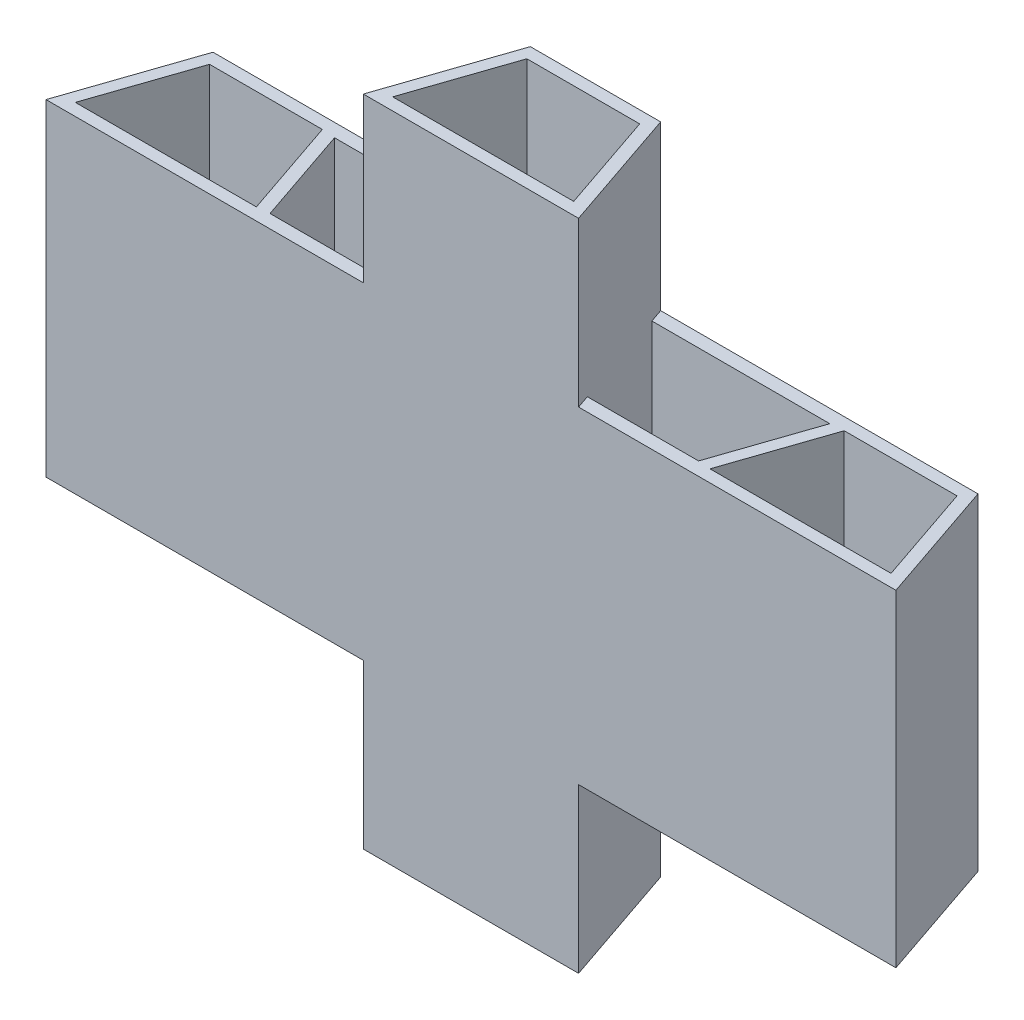
ISO-10303-21;
HEADER;
FILE_DESCRIPTION(('STEP AP214'),'2;1');
FILE_NAME('part.step','',(''),(''),'','','');
FILE_SCHEMA(('AUTOMOTIVE_DESIGN { 1 0 10303 214 1 1 1 1 }'));
ENDSEC;
DATA;
#1=APPLICATION_CONTEXT('core data for automotive mechanical design processes');
#2=APPLICATION_PROTOCOL_DEFINITION('international standard','automotive_design',2000,#1);
#3=PRODUCT_CONTEXT('',#1,'mechanical');
#4=PRODUCT('Part','Part','',(#3));
#5=PRODUCT_RELATED_PRODUCT_CATEGORY('part','',(#4));
#6=PRODUCT_DEFINITION_FORMATION('','',#4);
#7=PRODUCT_DEFINITION_CONTEXT('part definition',#1,'design');
#8=PRODUCT_DEFINITION('design','',#6,#7);
#9=PRODUCT_DEFINITION_SHAPE('','',#8);
#10=(LENGTH_UNIT() NAMED_UNIT(*) SI_UNIT(.MILLI.,.METRE.));
#11=(NAMED_UNIT(*) PLANE_ANGLE_UNIT() SI_UNIT($,.RADIAN.));
#12=(NAMED_UNIT(*) SI_UNIT($,.STERADIAN.) SOLID_ANGLE_UNIT());
#13=UNCERTAINTY_MEASURE_WITH_UNIT(LENGTH_MEASURE(1.E-05),#10,'distance_accuracy_value','');
#14=(GEOMETRIC_REPRESENTATION_CONTEXT(3) GLOBAL_UNCERTAINTY_ASSIGNED_CONTEXT((#13)) GLOBAL_UNIT_ASSIGNED_CONTEXT((#10,
#11,#12)) REPRESENTATION_CONTEXT('',''));
#15=CARTESIAN_POINT('',(0.,0.,0.));
#16=DIRECTION('',(0.,0.,1.));
#17=DIRECTION('',(1.,0.,0.));
#18=AXIS2_PLACEMENT_3D('',#15,#16,#17);
#19=CARTESIAN_POINT('',(-24.1922652634098,73.5,0.));
#20=DIRECTION('',(0.94651018817854,0.,0.322673927788139));
#21=DIRECTION('',(0.322673927788139,0.,-0.94651018817854));
#22=AXIS2_PLACEMENT_3D('',#19,#20,#21);
#23=PLANE('',#22);
#24=DIRECTION('',(0.322673927788138,0.,-0.94651018817854));
#25=VECTOR('',#24,1.);
#26=CARTESIAN_POINT('',(-24.1922652634098,36.75,0.));
#27=LINE('',#26,#25);
#28=CARTESIAN_POINT('',(-24.1922652634098,36.75,0.));
#29=VERTEX_POINT('',#28);
#30=CARTESIAN_POINT('',(-23.1695379906826,36.75,-2.99999999999999));
#31=VERTEX_POINT('',#30);
#32=EDGE_CURVE('E426',#29,#31,#27,.T.);
#33=ORIENTED_EDGE('',*,*,#32,.F.);
#34=DIRECTION('',(0.,-1.,0.));
#35=VECTOR('',#34,1.);
#36=CARTESIAN_POINT('',(-24.1922652634098,73.5,0.));
#37=LINE('',#36,#35);
#38=CARTESIAN_POINT('',(-24.1922652634098,73.5,0.));
#39=VERTEX_POINT('',#38);
#40=EDGE_CURVE('E553',#39,#29,#37,.T.);
#41=ORIENTED_EDGE('',*,*,#40,.F.);
#42=DIRECTION('',(-0.322673927788139,0.,0.94651018817854));
#43=VECTOR('',#42,1.);
#44=CARTESIAN_POINT('',(-24.1922652634098,73.5,0.));
#45=LINE('',#44,#43);
#46=CARTESIAN_POINT('',(-14.6468107179553,73.5,-28.));
#47=VERTEX_POINT('',#46);
#48=EDGE_CURVE('E535',#47,#39,#45,.T.);
#49=ORIENTED_EDGE('',*,*,#48,.F.);
#50=DIRECTION('',(0.,-1.,0.));
#51=VECTOR('',#50,1.);
#52=CARTESIAN_POINT('',(-14.6468107179553,73.5,-28.));
#53=LINE('',#52,#51);
#54=CARTESIAN_POINT('',(-14.6468107179553,36.75,-28.));
#55=VERTEX_POINT('',#54);
#56=EDGE_CURVE('E558',#47,#55,#53,.T.);
#57=ORIENTED_EDGE('',*,*,#56,.T.);
#58=DIRECTION('',(-0.32267392778814,0.,0.946510188178539));
#59=VECTOR('',#58,1.);
#60=CARTESIAN_POINT('',(-14.6468107179553,36.75,-28.));
#61=LINE('',#60,#59);
#62=CARTESIAN_POINT('',(-15.6695379906826,36.75,-25.));
#63=VERTEX_POINT('',#62);
#64=EDGE_CURVE('E411',#55,#63,#61,.T.);
#65=ORIENTED_EDGE('',*,*,#64,.T.);
#66=DIRECTION('',(0.,-1.,0.));
#67=VECTOR('',#66,1.);
#68=CARTESIAN_POINT('',(-15.6695379906826,36.75,-25.));
#69=LINE('',#68,#67);
#70=CARTESIAN_POINT('',(-15.6695379906826,-36.75,-25.));
#71=VERTEX_POINT('',#70);
#72=EDGE_CURVE('E472',#63,#71,#69,.T.);
#73=ORIENTED_EDGE('',*,*,#72,.T.);
#74=DIRECTION('',(-0.32267392778814,0.,0.946510188178539));
#75=VECTOR('',#74,1.);
#76=CARTESIAN_POINT('',(-14.6468107179553,-36.75,-28.));
#77=LINE('',#76,#75);
#78=CARTESIAN_POINT('',(-14.6468107179553,-36.75,-28.));
#79=VERTEX_POINT('',#78);
#80=EDGE_CURVE('E439',#79,#71,#77,.T.);
#81=ORIENTED_EDGE('',*,*,#80,.F.);
#82=CARTESIAN_POINT('',(-14.6468107179553,-73.5,-28.));
#83=VERTEX_POINT('',#82);
#84=EDGE_CURVE('E557',#79,#83,#53,.T.);
#85=ORIENTED_EDGE('',*,*,#84,.T.);
#86=DIRECTION('',(-0.322673927788139,0.,0.94651018817854));
#87=VECTOR('',#86,1.);
#88=CARTESIAN_POINT('',(-24.1922652634098,-73.5,0.));
#89=LINE('',#88,#87);
#90=CARTESIAN_POINT('',(-24.1922652634098,-73.5,0.));
#91=VERTEX_POINT('',#90);
#92=EDGE_CURVE('E529',#83,#91,#89,.T.);
#93=ORIENTED_EDGE('',*,*,#92,.T.);
#94=CARTESIAN_POINT('',(-24.1922652634098,-36.75,0.));
#95=VERTEX_POINT('',#94);
#96=EDGE_CURVE('E538',#95,#91,#37,.T.);
#97=ORIENTED_EDGE('',*,*,#96,.F.);
#98=DIRECTION('',(0.322673927788138,0.,-0.94651018817854));
#99=VECTOR('',#98,1.);
#100=CARTESIAN_POINT('',(-24.1922652634098,-36.75,0.));
#101=LINE('',#100,#99);
#102=CARTESIAN_POINT('',(-23.1695379906826,-36.75,-2.99999999999999));
#103=VERTEX_POINT('',#102);
#104=EDGE_CURVE('E453',#95,#103,#101,.T.);
#105=ORIENTED_EDGE('',*,*,#104,.T.);
#106=DIRECTION('',(0.,-1.,0.));
#107=VECTOR('',#106,1.);
#108=CARTESIAN_POINT('',(-23.1695379906826,36.75,-2.99999999999999));
#109=LINE('',#108,#107);
#110=EDGE_CURVE('E462',#31,#103,#109,.T.);
#111=ORIENTED_EDGE('',*,*,#110,.F.);
#112=EDGE_LOOP('',(#33,#41,#49,#57,#65,#73,#81,#85,#93,#97,#105,#111));
#113=FACE_BOUND('',#112,.T.);
#114=ADVANCED_FACE('F111',(#113),#23,.F.);
#115=CARTESIAN_POINT('',(0.,73.5,0.));
#116=DIRECTION('',(0.,1.,0.));
#117=DIRECTION('',(0.,0.,1.));
#118=AXIS2_PLACEMENT_3D('',#115,#116,#117);
#119=PLANE('',#118);
#120=DIRECTION('',(1.,0.,0.));
#121=VECTOR('',#120,1.);
#122=CARTESIAN_POINT('',(-24.1922652634098,73.5,0.));
#123=LINE('',#122,#121);
#124=CARTESIAN_POINT('',(24.1922652634099,73.5,0.));
#125=VERTEX_POINT('',#124);
#126=EDGE_CURVE('E524',#39,#125,#123,.T.);
#127=ORIENTED_EDGE('',*,*,#126,.T.);
#128=DIRECTION('',(-0.322673927788139,0.,-0.94651018817854));
#129=VECTOR('',#128,1.);
#130=CARTESIAN_POINT('',(24.1922652634099,73.5,0.));
#131=LINE('',#130,#129);
#132=CARTESIAN_POINT('',(14.6468107179553,73.5,-28.));
#133=VERTEX_POINT('',#132);
#134=EDGE_CURVE('E528',#125,#133,#131,.T.);
#135=ORIENTED_EDGE('',*,*,#134,.T.);
#136=DIRECTION('',(-1.,0.,0.));
#137=VECTOR('',#136,1.);
#138=CARTESIAN_POINT('',(14.6468107179553,73.5,-28.));
#139=LINE('',#138,#137);
#140=EDGE_CURVE('E532',#133,#47,#139,.T.);
#141=ORIENTED_EDGE('',*,*,#140,.T.);
#142=ORIENTED_EDGE('',*,*,#48,.T.);
#143=EDGE_LOOP('',(#127,#135,#141,#142));
#144=FACE_BOUND('',#143,.T.);
#145=DIRECTION('',(-1.,0.,0.));
#146=VECTOR('',#145,1.);
#147=CARTESIAN_POINT('',(12.6789008931629,73.5,-25.25));
#148=LINE('',#147,#146);
#149=CARTESIAN_POINT('',(12.6789008931629,73.5,-25.25));
#150=VERTEX_POINT('',#149);
#151=CARTESIAN_POINT('',(-12.6789008931629,73.5,-25.25));
#152=VERTEX_POINT('',#151);
#153=EDGE_CURVE('E484',#150,#152,#148,.T.);
#154=ORIENTED_EDGE('',*,*,#153,.F.);
#155=DIRECTION('',(-0.322673927788139,0.,-0.94651018817854));
#156=VECTOR('',#155,1.);
#157=CARTESIAN_POINT('',(20.3493554386175,73.5,-2.75));
#158=LINE('',#157,#156);
#159=CARTESIAN_POINT('',(20.3493554386175,73.5,-2.75));
#160=VERTEX_POINT('',#159);
#161=EDGE_CURVE('E481',#160,#150,#158,.T.);
#162=ORIENTED_EDGE('',*,*,#161,.F.);
#163=DIRECTION('',(1.,0.,0.));
#164=VECTOR('',#163,1.);
#165=CARTESIAN_POINT('',(-20.3493554386175,73.5,-2.75));
#166=LINE('',#165,#164);
#167=CARTESIAN_POINT('',(-20.3493554386175,73.5,-2.75));
#168=VERTEX_POINT('',#167);
#169=EDGE_CURVE('E492',#168,#160,#166,.T.);
#170=ORIENTED_EDGE('',*,*,#169,.F.);
#171=DIRECTION('',(-0.322673927788139,0.,0.94651018817854));
#172=VECTOR('',#171,1.);
#173=CARTESIAN_POINT('',(-20.3493554386175,73.5,-2.75));
#174=LINE('',#173,#172);
#175=EDGE_CURVE('E488',#152,#168,#174,.T.);
#176=ORIENTED_EDGE('',*,*,#175,.F.);
#177=EDGE_LOOP('',(#154,#162,#170,#176));
#178=FACE_BOUND('',#177,.T.);
#179=ADVANCED_FACE('F710',(#144,#178),#119,.T.);
#180=CARTESIAN_POINT('',(0.,-73.5,0.));
#181=DIRECTION('',(0.,1.,0.));
#182=DIRECTION('',(0.,0.,1.));
#183=AXIS2_PLACEMENT_3D('',#180,#181,#182);
#184=PLANE('',#183);
#185=DIRECTION('',(1.,0.,0.));
#186=VECTOR('',#185,1.);
#187=CARTESIAN_POINT('',(-24.1922652634098,-73.5,0.));
#188=LINE('',#187,#186);
#189=CARTESIAN_POINT('',(24.1922652634099,-73.5,0.));
#190=VERTEX_POINT('',#189);
#191=EDGE_CURVE('E523',#91,#190,#188,.T.);
#192=ORIENTED_EDGE('',*,*,#191,.F.);
#193=ORIENTED_EDGE('',*,*,#92,.F.);
#194=DIRECTION('',(-1.,0.,0.));
#195=VECTOR('',#194,1.);
#196=CARTESIAN_POINT('',(14.6468107179553,-73.5,-28.));
#197=LINE('',#196,#195);
#198=CARTESIAN_POINT('',(14.6468107179553,-73.5,-28.));
#199=VERTEX_POINT('',#198);
#200=EDGE_CURVE('E546',#199,#83,#197,.T.);
#201=ORIENTED_EDGE('',*,*,#200,.F.);
#202=DIRECTION('',(-0.322673927788139,0.,-0.94651018817854));
#203=VECTOR('',#202,1.);
#204=CARTESIAN_POINT('',(24.1922652634099,-73.5,0.));
#205=LINE('',#204,#203);
#206=EDGE_CURVE('E542',#190,#199,#205,.T.);
#207=ORIENTED_EDGE('',*,*,#206,.F.);
#208=EDGE_LOOP('',(#192,#193,#201,#207));
#209=FACE_BOUND('',#208,.T.);
#210=DIRECTION('',(-0.322673927788139,0.,-0.94651018817854));
#211=VECTOR('',#210,1.);
#212=CARTESIAN_POINT('',(20.3493554386175,-73.5,-2.75));
#213=LINE('',#212,#211);
#214=CARTESIAN_POINT('',(20.3493554386175,-73.5,-2.75));
#215=VERTEX_POINT('',#214);
#216=CARTESIAN_POINT('',(12.6789008931629,-73.5,-25.25));
#217=VERTEX_POINT('',#216);
#218=EDGE_CURVE('E480',#215,#217,#213,.T.);
#219=ORIENTED_EDGE('',*,*,#218,.T.);
#220=DIRECTION('',(-1.,0.,0.));
#221=VECTOR('',#220,1.);
#222=CARTESIAN_POINT('',(12.6789008931629,-73.5,-25.25));
#223=LINE('',#222,#221);
#224=CARTESIAN_POINT('',(-12.6789008931629,-73.5,-25.25));
#225=VERTEX_POINT('',#224);
#226=EDGE_CURVE('E499',#217,#225,#223,.T.);
#227=ORIENTED_EDGE('',*,*,#226,.T.);
#228=DIRECTION('',(-0.322673927788139,0.,0.94651018817854));
#229=VECTOR('',#228,1.);
#230=CARTESIAN_POINT('',(-20.3493554386175,-73.5,-2.75));
#231=LINE('',#230,#229);
#232=CARTESIAN_POINT('',(-20.3493554386175,-73.5,-2.75));
#233=VERTEX_POINT('',#232);
#234=EDGE_CURVE('E503',#225,#233,#231,.T.);
#235=ORIENTED_EDGE('',*,*,#234,.T.);
#236=DIRECTION('',(1.,0.,0.));
#237=VECTOR('',#236,1.);
#238=CARTESIAN_POINT('',(-20.3493554386175,-73.5,-2.75));
#239=LINE('',#238,#237);
#240=EDGE_CURVE('E485',#233,#215,#239,.T.);
#241=ORIENTED_EDGE('',*,*,#240,.T.);
#242=EDGE_LOOP('',(#219,#227,#235,#241));
#243=FACE_BOUND('',#242,.T.);
#244=ADVANCED_FACE('F584',(#209,#243),#184,.F.);
#245=CARTESIAN_POINT('',(-24.1922652634098,73.5,0.));
#246=DIRECTION('',(0.,0.,-1.));
#247=DIRECTION('',(-1.,0.,0.));
#248=AXIS2_PLACEMENT_3D('',#245,#246,#247);
#249=PLANE('',#248);
#250=ORIENTED_EDGE('',*,*,#191,.T.);
#251=DIRECTION('',(0.,-1.,0.));
#252=VECTOR('',#251,1.);
#253=CARTESIAN_POINT('',(24.1922652634099,73.5,0.));
#254=LINE('',#253,#252);
#255=CARTESIAN_POINT('',(24.1922652634098,-36.75,0.));
#256=VERTEX_POINT('',#255);
#257=EDGE_CURVE('E120',#256,#190,#254,.T.);
#258=ORIENTED_EDGE('',*,*,#257,.F.);
#259=DIRECTION('',(-1.,0.,0.));
#260=VECTOR('',#259,1.);
#261=CARTESIAN_POINT('',(95.531341244775,-36.75,0.));
#262=LINE('',#261,#260);
#263=CARTESIAN_POINT('',(95.531341244775,-36.75,0.));
#264=VERTEX_POINT('',#263);
#265=EDGE_CURVE('E616',#264,#256,#262,.T.);
#266=ORIENTED_EDGE('',*,*,#265,.F.);
#267=DIRECTION('',(0.,-1.,0.));
#268=VECTOR('',#267,1.);
#269=CARTESIAN_POINT('',(95.531341244775,36.75,0.));
#270=LINE('',#269,#268);
#271=CARTESIAN_POINT('',(95.531341244775,36.75,0.));
#272=VERTEX_POINT('',#271);
#273=EDGE_CURVE('E641',#272,#264,#270,.T.);
#274=ORIENTED_EDGE('',*,*,#273,.F.);
#275=DIRECTION('',(-1.,0.,0.));
#276=VECTOR('',#275,1.);
#277=CARTESIAN_POINT('',(95.531341244775,36.75,0.));
#278=LINE('',#277,#276);
#279=CARTESIAN_POINT('',(24.1922652634099,36.75,0.));
#280=VERTEX_POINT('',#279);
#281=EDGE_CURVE('E637',#272,#280,#278,.T.);
#282=ORIENTED_EDGE('',*,*,#281,.T.);
#283=EDGE_CURVE('E12',#125,#280,#254,.T.);
#284=ORIENTED_EDGE('',*,*,#283,.F.);
#285=ORIENTED_EDGE('',*,*,#126,.F.);
#286=ORIENTED_EDGE('',*,*,#40,.T.);
#287=DIRECTION('',(1.,0.,0.));
#288=VECTOR('',#287,1.);
#289=CARTESIAN_POINT('',(-95.531341244775,36.75,0.));
#290=LINE('',#289,#288);
#291=CARTESIAN_POINT('',(-95.531341244775,36.75,0.));
#292=VERTEX_POINT('',#291);
#293=EDGE_CURVE('E423',#292,#29,#290,.T.);
#294=ORIENTED_EDGE('',*,*,#293,.F.);
#295=DIRECTION('',(0.,-1.,0.));
#296=VECTOR('',#295,1.);
#297=CARTESIAN_POINT('',(-95.531341244775,36.75,0.));
#298=LINE('',#297,#296);
#299=CARTESIAN_POINT('',(-95.531341244775,-36.75,0.));
#300=VERTEX_POINT('',#299);
#301=EDGE_CURVE('E466',#292,#300,#298,.T.);
#302=ORIENTED_EDGE('',*,*,#301,.T.);
#303=DIRECTION('',(1.,0.,0.));
#304=VECTOR('',#303,1.);
#305=CARTESIAN_POINT('',(-95.531341244775,-36.75,0.));
#306=LINE('',#305,#304);
#307=EDGE_CURVE('E450',#300,#95,#306,.T.);
#308=ORIENTED_EDGE('',*,*,#307,.T.);
#309=ORIENTED_EDGE('',*,*,#96,.T.);
#310=EDGE_LOOP('',(#250,#258,#266,#274,#282,#284,#285,#286,#294,#302,#308,#309));
#311=FACE_BOUND('',#310,.T.);
#312=ADVANCED_FACE('F113',(#311),#249,.F.);
#313=CARTESIAN_POINT('',(24.1922652634099,73.5,0.));
#314=DIRECTION('',(-0.94651018817854,0.,0.322673927788139));
#315=DIRECTION('',(0.322673927788139,0.,0.94651018817854));
#316=AXIS2_PLACEMENT_3D('',#313,#314,#315);
#317=PLANE('',#316);
#318=DIRECTION('',(0.,-1.,0.));
#319=VECTOR('',#318,1.);
#320=CARTESIAN_POINT('',(15.6695379906826,36.75,-25.));
#321=LINE('',#320,#319);
#322=CARTESIAN_POINT('',(15.6695379906826,36.75,-25.));
#323=VERTEX_POINT('',#322);
#324=CARTESIAN_POINT('',(15.6695379906826,-36.75,-25.));
#325=VERTEX_POINT('',#324);
#326=EDGE_CURVE('E679',#323,#325,#321,.T.);
#327=ORIENTED_EDGE('',*,*,#326,.F.);
#328=DIRECTION('',(0.32267392778814,0.,0.946510188178539));
#329=VECTOR('',#328,1.);
#330=CARTESIAN_POINT('',(14.6468107179553,36.75,-28.));
#331=LINE('',#330,#329);
#332=CARTESIAN_POINT('',(14.6468107179553,36.75,-28.));
#333=VERTEX_POINT('',#332);
#334=EDGE_CURVE('E620',#333,#323,#331,.T.);
#335=ORIENTED_EDGE('',*,*,#334,.F.);
#336=DIRECTION('',(0.,-1.,0.));
#337=VECTOR('',#336,1.);
#338=CARTESIAN_POINT('',(14.6468107179553,73.5,-28.));
#339=LINE('',#338,#337);
#340=EDGE_CURVE('E562',#133,#333,#339,.T.);
#341=ORIENTED_EDGE('',*,*,#340,.F.);
#342=ORIENTED_EDGE('',*,*,#134,.F.);
#343=ORIENTED_EDGE('',*,*,#283,.T.);
#344=DIRECTION('',(-0.322673927788138,0.,-0.94651018817854));
#345=VECTOR('',#344,1.);
#346=CARTESIAN_POINT('',(24.1922652634098,36.75,0.));
#347=LINE('',#346,#345);
#348=CARTESIAN_POINT('',(23.1695379906826,36.75,-2.99999999999999));
#349=VERTEX_POINT('',#348);
#350=EDGE_CURVE('E131',#280,#349,#347,.T.);
#351=ORIENTED_EDGE('',*,*,#350,.T.);
#352=DIRECTION('',(0.,-1.,0.));
#353=VECTOR('',#352,1.);
#354=CARTESIAN_POINT('',(23.1695379906826,36.75,-2.99999999999999));
#355=LINE('',#354,#353);
#356=CARTESIAN_POINT('',(23.1695379906826,-36.75,-2.99999999999999));
#357=VERTEX_POINT('',#356);
#358=EDGE_CURVE('E127',#349,#357,#355,.T.);
#359=ORIENTED_EDGE('',*,*,#358,.T.);
#360=DIRECTION('',(-0.322673927788138,0.,-0.94651018817854));
#361=VECTOR('',#360,1.);
#362=CARTESIAN_POINT('',(24.1922652634098,-36.75,0.));
#363=LINE('',#362,#361);
#364=EDGE_CURVE('E662',#256,#357,#363,.T.);
#365=ORIENTED_EDGE('',*,*,#364,.F.);
#366=ORIENTED_EDGE('',*,*,#257,.T.);
#367=ORIENTED_EDGE('',*,*,#206,.T.);
#368=CARTESIAN_POINT('',(14.6468107179553,-36.75,-28.));
#369=VERTEX_POINT('',#368);
#370=EDGE_CURVE('E561',#369,#199,#339,.T.);
#371=ORIENTED_EDGE('',*,*,#370,.F.);
#372=DIRECTION('',(0.32267392778814,0.,0.946510188178539));
#373=VECTOR('',#372,1.);
#374=CARTESIAN_POINT('',(14.6468107179553,-36.75,-28.));
#375=LINE('',#374,#373);
#376=EDGE_CURVE('E647',#369,#325,#375,.T.);
#377=ORIENTED_EDGE('',*,*,#376,.T.);
#378=EDGE_LOOP('',(#327,#335,#341,#342,#343,#351,#359,#365,#366,#367,#371,#377));
#379=FACE_BOUND('',#378,.T.);
#380=ADVANCED_FACE('F581',(#379),#317,.F.);
#381=CARTESIAN_POINT('',(14.6468107179553,73.5,-28.));
#382=DIRECTION('',(0.,0.,1.));
#383=DIRECTION('',(1.,0.,0.));
#384=AXIS2_PLACEMENT_3D('',#381,#382,#383);
#385=PLANE('',#384);
#386=ORIENTED_EDGE('',*,*,#200,.T.);
#387=ORIENTED_EDGE('',*,*,#84,.F.);
#388=DIRECTION('',(1.,0.,0.));
#389=VECTOR('',#388,1.);
#390=CARTESIAN_POINT('',(-85.9858866993205,-36.75,-28.));
#391=LINE('',#390,#389);
#392=CARTESIAN_POINT('',(-85.9858866993205,-36.75,-28.));
#393=VERTEX_POINT('',#392);
#394=EDGE_CURVE('E443',#393,#79,#391,.T.);
#395=ORIENTED_EDGE('',*,*,#394,.F.);
#396=DIRECTION('',(0.,-1.,0.));
#397=VECTOR('',#396,1.);
#398=CARTESIAN_POINT('',(-85.9858866993205,36.75,-28.));
#399=LINE('',#398,#397);
#400=CARTESIAN_POINT('',(-85.9858866993205,36.75,-28.));
#401=VERTEX_POINT('',#400);
#402=EDGE_CURVE('E469',#401,#393,#399,.T.);
#403=ORIENTED_EDGE('',*,*,#402,.F.);
#404=DIRECTION('',(1.,0.,0.));
#405=VECTOR('',#404,1.);
#406=CARTESIAN_POINT('',(-85.9858866993205,36.75,-28.));
#407=LINE('',#406,#405);
#408=EDGE_CURVE('E415',#401,#55,#407,.T.);
#409=ORIENTED_EDGE('',*,*,#408,.T.);
#410=ORIENTED_EDGE('',*,*,#56,.F.);
#411=ORIENTED_EDGE('',*,*,#140,.F.);
#412=ORIENTED_EDGE('',*,*,#340,.T.);
#413=DIRECTION('',(-1.,0.,0.));
#414=VECTOR('',#413,1.);
#415=CARTESIAN_POINT('',(85.9858866993205,36.75,-28.));
#416=LINE('',#415,#414);
#417=CARTESIAN_POINT('',(85.9858866993205,36.75,-28.));
#418=VERTEX_POINT('',#417);
#419=EDGE_CURVE('E617',#418,#333,#416,.T.);
#420=ORIENTED_EDGE('',*,*,#419,.F.);
#421=DIRECTION('',(0.,-1.,0.));
#422=VECTOR('',#421,1.);
#423=CARTESIAN_POINT('',(85.9858866993205,36.75,-28.));
#424=LINE('',#423,#422);
#425=CARTESIAN_POINT('',(85.9858866993205,-36.75,-28.));
#426=VERTEX_POINT('',#425);
#427=EDGE_CURVE('E682',#418,#426,#424,.T.);
#428=ORIENTED_EDGE('',*,*,#427,.T.);
#429=DIRECTION('',(-1.,0.,0.));
#430=VECTOR('',#429,1.);
#431=CARTESIAN_POINT('',(85.9858866993205,-36.75,-28.));
#432=LINE('',#431,#430);
#433=EDGE_CURVE('E577',#426,#369,#432,.T.);
#434=ORIENTED_EDGE('',*,*,#433,.T.);
#435=ORIENTED_EDGE('',*,*,#370,.T.);
#436=EDGE_LOOP('',(#386,#387,#395,#403,#409,#410,#411,#412,#420,#428,#434,#435));
#437=FACE_BOUND('',#436,.T.);
#438=ADVANCED_FACE('F572',(#437),#385,.F.);
#439=CARTESIAN_POINT('',(20.3493554386175,73.5,-2.75));
#440=DIRECTION('',(-0.94651018817854,0.,0.322673927788139));
#441=DIRECTION('',(0.322673927788139,0.,0.94651018817854));
#442=AXIS2_PLACEMENT_3D('',#439,#440,#441);
#443=PLANE('',#442);
#444=ORIENTED_EDGE('',*,*,#218,.F.);
#445=DIRECTION('',(0.,-1.,0.));
#446=VECTOR('',#445,1.);
#447=CARTESIAN_POINT('',(20.3493554386175,73.5,-2.75));
#448=LINE('',#447,#446);
#449=EDGE_CURVE('E495',#160,#215,#448,.T.);
#450=ORIENTED_EDGE('',*,*,#449,.F.);
#451=ORIENTED_EDGE('',*,*,#161,.T.);
#452=DIRECTION('',(0.,-1.,0.));
#453=VECTOR('',#452,1.);
#454=CARTESIAN_POINT('',(12.6789008931629,73.5,-25.25));
#455=LINE('',#454,#453);
#456=EDGE_CURVE('E519',#150,#217,#455,.T.);
#457=ORIENTED_EDGE('',*,*,#456,.T.);
#458=EDGE_LOOP('',(#444,#450,#451,#457));
#459=FACE_BOUND('',#458,.T.);
#460=ADVANCED_FACE('F758',(#459),#443,.T.);
#461=CARTESIAN_POINT('',(12.6789008931629,73.5,-25.25));
#462=DIRECTION('',(0.,0.,1.));
#463=DIRECTION('',(1.,0.,0.));
#464=AXIS2_PLACEMENT_3D('',#461,#462,#463);
#465=PLANE('',#464);
#466=ORIENTED_EDGE('',*,*,#226,.F.);
#467=ORIENTED_EDGE('',*,*,#456,.F.);
#468=ORIENTED_EDGE('',*,*,#153,.T.);
#469=DIRECTION('',(0.,-1.,0.));
#470=VECTOR('',#469,1.);
#471=CARTESIAN_POINT('',(-12.6789008931629,73.5,-25.25));
#472=LINE('',#471,#470);
#473=EDGE_CURVE('E516',#152,#225,#472,.T.);
#474=ORIENTED_EDGE('',*,*,#473,.T.);
#475=EDGE_LOOP('',(#466,#467,#468,#474));
#476=FACE_BOUND('',#475,.T.);
#477=ADVANCED_FACE('F804',(#476),#465,.T.);
#478=CARTESIAN_POINT('',(-20.3493554386175,73.5,-2.75));
#479=DIRECTION('',(0.94651018817854,0.,0.322673927788139));
#480=DIRECTION('',(0.322673927788139,0.,-0.94651018817854));
#481=AXIS2_PLACEMENT_3D('',#478,#479,#480);
#482=PLANE('',#481);
#483=ORIENTED_EDGE('',*,*,#234,.F.);
#484=ORIENTED_EDGE('',*,*,#473,.F.);
#485=ORIENTED_EDGE('',*,*,#175,.T.);
#486=DIRECTION('',(0.,-1.,0.));
#487=VECTOR('',#486,1.);
#488=CARTESIAN_POINT('',(-20.3493554386175,73.5,-2.75));
#489=LINE('',#488,#487);
#490=EDGE_CURVE('E513',#168,#233,#489,.T.);
#491=ORIENTED_EDGE('',*,*,#490,.T.);
#492=EDGE_LOOP('',(#483,#484,#485,#491));
#493=FACE_BOUND('',#492,.T.);
#494=ADVANCED_FACE('F813',(#493),#482,.T.);
#495=CARTESIAN_POINT('',(-20.3493554386175,73.5,-2.75));
#496=DIRECTION('',(0.,0.,-1.));
#497=DIRECTION('',(-1.,0.,0.));
#498=AXIS2_PLACEMENT_3D('',#495,#496,#497);
#499=PLANE('',#498);
#500=ORIENTED_EDGE('',*,*,#240,.F.);
#501=ORIENTED_EDGE('',*,*,#490,.F.);
#502=ORIENTED_EDGE('',*,*,#169,.T.);
#503=ORIENTED_EDGE('',*,*,#449,.T.);
#504=EDGE_LOOP('',(#500,#501,#502,#503));
#505=FACE_BOUND('',#504,.T.);
#506=ADVANCED_FACE('F747',(#505),#499,.T.);
#507=CARTESIAN_POINT('',(-48.1695379906826,36.75,-2.99999999999999));
#508=DIRECTION('',(-0.94651018817854,0.,0.322673927788138));
#509=DIRECTION('',(0.322673927788138,0.,0.94651018817854));
#510=AXIS2_PLACEMENT_3D('',#507,#508,#509);
#511=PLANE('',#510);
#512=DIRECTION('',(-0.322673927788138,0.,-0.94651018817854));
#513=VECTOR('',#512,1.);
#514=CARTESIAN_POINT('',(-48.1695379906826,-36.75,-2.99999999999999));
#515=LINE('',#514,#513);
#516=CARTESIAN_POINT('',(-48.1695379906826,-36.75,-2.99999999999999));
#517=VERTEX_POINT('',#516);
#518=CARTESIAN_POINT('',(-55.6695379906826,-36.75,-25.));
#519=VERTEX_POINT('',#518);
#520=EDGE_CURVE('E402',#517,#519,#515,.T.);
#521=ORIENTED_EDGE('',*,*,#520,.T.);
#522=DIRECTION('',(0.,-1.,0.));
#523=VECTOR('',#522,1.);
#524=CARTESIAN_POINT('',(-55.6695379906826,36.75,-25.));
#525=LINE('',#524,#523);
#526=CARTESIAN_POINT('',(-55.6695379906826,36.75,-25.));
#527=VERTEX_POINT('',#526);
#528=EDGE_CURVE('E476',#527,#519,#525,.T.);
#529=ORIENTED_EDGE('',*,*,#528,.F.);
#530=DIRECTION('',(-0.322673927788138,0.,-0.94651018817854));
#531=VECTOR('',#530,1.);
#532=CARTESIAN_POINT('',(-48.1695379906826,36.75,-2.99999999999999));
#533=LINE('',#532,#531);
#534=CARTESIAN_POINT('',(-48.1695379906826,36.75,-2.99999999999999));
#535=VERTEX_POINT('',#534);
#536=EDGE_CURVE('E403',#535,#527,#533,.T.);
#537=ORIENTED_EDGE('',*,*,#536,.F.);
#538=DIRECTION('',(0.,-1.,0.));
#539=VECTOR('',#538,1.);
#540=CARTESIAN_POINT('',(-48.1695379906826,36.75,-2.99999999999999));
#541=LINE('',#540,#539);
#542=EDGE_CURVE('E432',#535,#517,#541,.T.);
#543=ORIENTED_EDGE('',*,*,#542,.T.);
#544=EDGE_LOOP('',(#521,#529,#537,#543));
#545=FACE_BOUND('',#544,.T.);
#546=ADVANCED_FACE('F737',(#545),#511,.F.);
#547=CARTESIAN_POINT('',(-55.6695379906826,36.75,-25.));
#548=DIRECTION('',(0.,0.,-1.));
#549=DIRECTION('',(-1.,0.,0.));
#550=AXIS2_PLACEMENT_3D('',#547,#548,#549);
#551=PLANE('',#550);
#552=DIRECTION('',(1.,0.,0.));
#553=VECTOR('',#552,1.);
#554=CARTESIAN_POINT('',(-55.6695379906826,-36.75,-25.));
#555=LINE('',#554,#553);
#556=EDGE_CURVE('E436',#519,#71,#555,.T.);
#557=ORIENTED_EDGE('',*,*,#556,.T.);
#558=ORIENTED_EDGE('',*,*,#72,.F.);
#559=DIRECTION('',(1.,0.,0.));
#560=VECTOR('',#559,1.);
#561=CARTESIAN_POINT('',(-55.6695379906826,36.75,-25.));
#562=LINE('',#561,#560);
#563=EDGE_CURVE('E407',#527,#63,#562,.T.);
#564=ORIENTED_EDGE('',*,*,#563,.F.);
#565=ORIENTED_EDGE('',*,*,#528,.T.);
#566=EDGE_LOOP('',(#557,#558,#564,#565));
#567=FACE_BOUND('',#566,.T.);
#568=ADVANCED_FACE('F739',(#567),#551,.F.);
#569=CARTESIAN_POINT('',(-95.531341244775,36.75,0.));
#570=DIRECTION('',(-0.94651018817854,0.,-0.322673927788139));
#571=DIRECTION('',(-0.322673927788139,0.,0.94651018817854));
#572=AXIS2_PLACEMENT_3D('',#569,#570,#571);
#573=PLANE('',#572);
#574=DIRECTION('',(0.322673927788139,0.,-0.94651018817854));
#575=VECTOR('',#574,1.);
#576=CARTESIAN_POINT('',(-95.531341244775,-36.75,0.));
#577=LINE('',#576,#575);
#578=EDGE_CURVE('E446',#300,#393,#577,.T.);
#579=ORIENTED_EDGE('',*,*,#578,.F.);
#580=ORIENTED_EDGE('',*,*,#301,.F.);
#581=DIRECTION('',(0.322673927788139,0.,-0.94651018817854));
#582=VECTOR('',#581,1.);
#583=CARTESIAN_POINT('',(-95.531341244775,36.75,0.));
#584=LINE('',#583,#582);
#585=EDGE_CURVE('E419',#292,#401,#584,.T.);
#586=ORIENTED_EDGE('',*,*,#585,.T.);
#587=ORIENTED_EDGE('',*,*,#402,.T.);
#588=EDGE_LOOP('',(#579,#580,#586,#587));
#589=FACE_BOUND('',#588,.T.);
#590=ADVANCED_FACE('F724',(#589),#573,.T.);
#591=CARTESIAN_POINT('',(-23.1695379906826,36.75,-2.99999999999999));
#592=DIRECTION('',(0.,0.,1.));
#593=DIRECTION('',(1.,0.,0.));
#594=AXIS2_PLACEMENT_3D('',#591,#592,#593);
#595=PLANE('',#594);
#596=DIRECTION('',(-1.,0.,0.));
#597=VECTOR('',#596,1.);
#598=CARTESIAN_POINT('',(-23.1695379906826,-36.75,-2.99999999999999));
#599=LINE('',#598,#597);
#600=EDGE_CURVE('E408',#103,#517,#599,.T.);
#601=ORIENTED_EDGE('',*,*,#600,.T.);
#602=ORIENTED_EDGE('',*,*,#542,.F.);
#603=DIRECTION('',(-1.,0.,0.));
#604=VECTOR('',#603,1.);
#605=CARTESIAN_POINT('',(-23.1695379906826,36.75,-2.99999999999999));
#606=LINE('',#605,#604);
#607=EDGE_CURVE('E429',#31,#535,#606,.T.);
#608=ORIENTED_EDGE('',*,*,#607,.F.);
#609=ORIENTED_EDGE('',*,*,#110,.T.);
#610=EDGE_LOOP('',(#601,#602,#608,#609));
#611=FACE_BOUND('',#610,.T.);
#612=ADVANCED_FACE('F731',(#611),#595,.F.);
#613=CARTESIAN_POINT('',(0.,36.75,0.));
#614=DIRECTION('',(0.,-1.,0.));
#615=DIRECTION('',(0.,0.,-1.));
#616=AXIS2_PLACEMENT_3D('',#613,#614,#615);
#617=PLANE('',#616);
#618=DIRECTION('',(0.322673927788139,0.,-0.94651018817854));
#619=VECTOR('',#618,1.);
#620=CARTESIAN_POINT('',(-82.98186174414,36.75,-28.2892710491386));
#621=LINE('',#620,#619);
#622=CARTESIAN_POINT('',(-91.6884314199827,36.75,-2.75));
#623=VERTEX_POINT('',#622);
#624=CARTESIAN_POINT('',(-84.0179768745281,36.75,-25.25));
#625=VERTEX_POINT('',#624);
#626=EDGE_CURVE('E362',#623,#625,#621,.T.);
#627=ORIENTED_EDGE('',*,*,#626,.T.);
#628=DIRECTION('',(1.,0.,0.));
#629=VECTOR('',#628,1.);
#630=CARTESIAN_POINT('',(0.,36.75,-25.25));
#631=LINE('',#630,#629);
#632=CARTESIAN_POINT('',(-58.6601750882022,36.75,-25.25));
#633=VERTEX_POINT('',#632);
#634=EDGE_CURVE('E358',#625,#633,#631,.T.);
#635=ORIENTED_EDGE('',*,*,#634,.T.);
#636=DIRECTION('',(0.322673927788138,0.,0.94651018817854));
#637=VECTOR('',#636,1.);
#638=CARTESIAN_POINT('',(-44.8408602363533,36.75,15.2866568987568));
#639=LINE('',#638,#637);
#640=CARTESIAN_POINT('',(-50.9897205427477,36.75,-2.74999999999999));
#641=VERTEX_POINT('',#640);
#642=EDGE_CURVE('E371',#633,#641,#639,.T.);
#643=ORIENTED_EDGE('',*,*,#642,.T.);
#644=DIRECTION('',(-1.,0.,0.));
#645=VECTOR('',#644,1.);
#646=CARTESIAN_POINT('',(0.,36.75,-2.75));
#647=LINE('',#646,#645);
#648=EDGE_CURVE('E367',#641,#623,#647,.T.);
#649=ORIENTED_EDGE('',*,*,#648,.T.);
#650=EDGE_LOOP('',(#627,#635,#643,#649));
#651=FACE_BOUND('',#650,.T.);
#652=ORIENTED_EDGE('',*,*,#536,.T.);
#653=ORIENTED_EDGE('',*,*,#563,.T.);
#654=ORIENTED_EDGE('',*,*,#64,.F.);
#655=ORIENTED_EDGE('',*,*,#408,.F.);
#656=ORIENTED_EDGE('',*,*,#585,.F.);
#657=ORIENTED_EDGE('',*,*,#293,.T.);
#658=ORIENTED_EDGE('',*,*,#32,.T.);
#659=ORIENTED_EDGE('',*,*,#607,.T.);
#660=EDGE_LOOP('',(#652,#653,#654,#655,#656,#657,#658,#659));
#661=FACE_BOUND('',#660,.T.);
#662=ADVANCED_FACE('F721',(#651,#661),#617,.F.);
#663=CARTESIAN_POINT('',(0.,-36.75,0.));
#664=DIRECTION('',(0.,-1.,0.));
#665=DIRECTION('',(0.,0.,-1.));
#666=AXIS2_PLACEMENT_3D('',#663,#664,#665);
#667=PLANE('',#666);
#668=DIRECTION('',(1.,0.,0.));
#669=VECTOR('',#668,1.);
#670=CARTESIAN_POINT('',(0.,-36.75,-25.25));
#671=LINE('',#670,#669);
#672=CARTESIAN_POINT('',(-84.0179768745281,-36.75,-25.25));
#673=VERTEX_POINT('',#672);
#674=CARTESIAN_POINT('',(-58.6601750882022,-36.75,-25.25));
#675=VERTEX_POINT('',#674);
#676=EDGE_CURVE('E376',#673,#675,#671,.T.);
#677=ORIENTED_EDGE('',*,*,#676,.F.);
#678=DIRECTION('',(0.322673927788139,0.,-0.94651018817854));
#679=VECTOR('',#678,1.);
#680=CARTESIAN_POINT('',(-82.98186174414,-36.75,-28.2892710491386));
#681=LINE('',#680,#679);
#682=CARTESIAN_POINT('',(-91.6884314199827,-36.75,-2.75));
#683=VERTEX_POINT('',#682);
#684=EDGE_CURVE('E379',#683,#673,#681,.T.);
#685=ORIENTED_EDGE('',*,*,#684,.F.);
#686=DIRECTION('',(-1.,0.,0.));
#687=VECTOR('',#686,1.);
#688=CARTESIAN_POINT('',(0.,-36.75,-2.75));
#689=LINE('',#688,#687);
#690=CARTESIAN_POINT('',(-50.9897205427477,-36.75,-2.75));
#691=VERTEX_POINT('',#690);
#692=EDGE_CURVE('E383',#691,#683,#689,.T.);
#693=ORIENTED_EDGE('',*,*,#692,.F.);
#694=DIRECTION('',(0.322673927788138,0.,0.94651018817854));
#695=VECTOR('',#694,1.);
#696=CARTESIAN_POINT('',(-44.8408602363533,-36.75,15.2866568987568));
#697=LINE('',#696,#695);
#698=EDGE_CURVE('E363',#675,#691,#697,.T.);
#699=ORIENTED_EDGE('',*,*,#698,.F.);
#700=EDGE_LOOP('',(#677,#685,#693,#699));
#701=FACE_BOUND('',#700,.T.);
#702=ORIENTED_EDGE('',*,*,#520,.F.);
#703=ORIENTED_EDGE('',*,*,#600,.F.);
#704=ORIENTED_EDGE('',*,*,#104,.F.);
#705=ORIENTED_EDGE('',*,*,#307,.F.);
#706=ORIENTED_EDGE('',*,*,#578,.T.);
#707=ORIENTED_EDGE('',*,*,#394,.T.);
#708=ORIENTED_EDGE('',*,*,#80,.T.);
#709=ORIENTED_EDGE('',*,*,#556,.F.);
#710=EDGE_LOOP('',(#702,#703,#704,#705,#706,#707,#708,#709));
#711=FACE_BOUND('',#710,.T.);
#712=ADVANCED_FACE('F727',(#701,#711),#667,.T.);
#713=CARTESIAN_POINT('',(0.,36.75,-25.25));
#714=DIRECTION('',(0.,0.,-1.));
#715=DIRECTION('',(-1.,0.,0.));
#716=AXIS2_PLACEMENT_3D('',#713,#714,#715);
#717=PLANE('',#716);
#718=ORIENTED_EDGE('',*,*,#676,.T.);
#719=DIRECTION('',(0.,-1.,0.));
#720=VECTOR('',#719,1.);
#721=CARTESIAN_POINT('',(-58.6601750882022,36.75,-25.25));
#722=LINE('',#721,#720);
#723=EDGE_CURVE('E375',#633,#675,#722,.T.);
#724=ORIENTED_EDGE('',*,*,#723,.F.);
#725=ORIENTED_EDGE('',*,*,#634,.F.);
#726=DIRECTION('',(0.,-1.,0.));
#727=VECTOR('',#726,1.);
#728=CARTESIAN_POINT('',(-84.0179768745281,36.75,-25.25));
#729=LINE('',#728,#727);
#730=EDGE_CURVE('E399',#625,#673,#729,.T.);
#731=ORIENTED_EDGE('',*,*,#730,.T.);
#732=EDGE_LOOP('',(#718,#724,#725,#731));
#733=FACE_BOUND('',#732,.T.);
#734=ADVANCED_FACE('F879',(#733),#717,.F.);
#735=CARTESIAN_POINT('',(-82.98186174414,36.75,-28.2892710491386));
#736=DIRECTION('',(-0.94651018817854,0.,-0.322673927788139));
#737=DIRECTION('',(-0.322673927788139,0.,0.94651018817854));
#738=AXIS2_PLACEMENT_3D('',#735,#736,#737);
#739=PLANE('',#738);
#740=ORIENTED_EDGE('',*,*,#684,.T.);
#741=ORIENTED_EDGE('',*,*,#730,.F.);
#742=ORIENTED_EDGE('',*,*,#626,.F.);
#743=DIRECTION('',(0.,-1.,0.));
#744=VECTOR('',#743,1.);
#745=CARTESIAN_POINT('',(-91.6884314199827,36.75,-2.75));
#746=LINE('',#745,#744);
#747=EDGE_CURVE('E396',#623,#683,#746,.T.);
#748=ORIENTED_EDGE('',*,*,#747,.T.);
#749=EDGE_LOOP('',(#740,#741,#742,#748));
#750=FACE_BOUND('',#749,.T.);
#751=ADVANCED_FACE('F889',(#750),#739,.F.);
#752=CARTESIAN_POINT('',(0.,36.75,-2.75));
#753=DIRECTION('',(0.,0.,1.));
#754=DIRECTION('',(1.,0.,0.));
#755=AXIS2_PLACEMENT_3D('',#752,#753,#754);
#756=PLANE('',#755);
#757=ORIENTED_EDGE('',*,*,#692,.T.);
#758=ORIENTED_EDGE('',*,*,#747,.F.);
#759=ORIENTED_EDGE('',*,*,#648,.F.);
#760=DIRECTION('',(0.,-1.,0.));
#761=VECTOR('',#760,1.);
#762=CARTESIAN_POINT('',(-50.9897205427477,36.75,-2.75));
#763=LINE('',#762,#761);
#764=EDGE_CURVE('E393',#641,#691,#763,.T.);
#765=ORIENTED_EDGE('',*,*,#764,.T.);
#766=EDGE_LOOP('',(#757,#758,#759,#765));
#767=FACE_BOUND('',#766,.T.);
#768=ADVANCED_FACE('F899',(#767),#756,.F.);
#769=CARTESIAN_POINT('',(-44.8408602363533,36.75,15.2866568987568));
#770=DIRECTION('',(0.94651018817854,0.,-0.322673927788138));
#771=DIRECTION('',(-0.322673927788138,0.,-0.94651018817854));
#772=AXIS2_PLACEMENT_3D('',#769,#770,#771);
#773=PLANE('',#772);
#774=ORIENTED_EDGE('',*,*,#698,.T.);
#775=ORIENTED_EDGE('',*,*,#764,.F.);
#776=ORIENTED_EDGE('',*,*,#642,.F.);
#777=ORIENTED_EDGE('',*,*,#723,.T.);
#778=EDGE_LOOP('',(#774,#775,#776,#777));
#779=FACE_BOUND('',#778,.T.);
#780=ADVANCED_FACE('F909',(#779),#773,.F.);
#781=CARTESIAN_POINT('',(0.,36.75,0.));
#782=DIRECTION('',(0.,1.,0.));
#783=DIRECTION('',(0.,0.,1.));
#784=AXIS2_PLACEMENT_3D('',#781,#782,#783);
#785=PLANE('',#784);
#786=DIRECTION('',(-0.322673927788139,0.,-0.94651018817854));
#787=VECTOR('',#786,1.);
#788=CARTESIAN_POINT('',(95.531341244775,36.75,0.));
#789=LINE('',#788,#787);
#790=EDGE_CURVE('E612',#272,#418,#789,.T.);
#791=ORIENTED_EDGE('',*,*,#790,.T.);
#792=ORIENTED_EDGE('',*,*,#419,.T.);
#793=ORIENTED_EDGE('',*,*,#334,.T.);
#794=DIRECTION('',(-1.,0.,0.));
#795=VECTOR('',#794,1.);
#796=CARTESIAN_POINT('',(55.6695379906826,36.75,-25.));
#797=LINE('',#796,#795);
#798=CARTESIAN_POINT('',(55.6695379906826,36.75,-25.));
#799=VERTEX_POINT('',#798);
#800=EDGE_CURVE('E623',#799,#323,#797,.T.);
#801=ORIENTED_EDGE('',*,*,#800,.F.);
#802=DIRECTION('',(0.322673927788138,0.,-0.94651018817854));
#803=VECTOR('',#802,1.);
#804=CARTESIAN_POINT('',(48.1695379906826,36.75,-2.99999999999999));
#805=LINE('',#804,#803);
#806=CARTESIAN_POINT('',(48.1695379906826,36.75,-2.99999999999999));
#807=VERTEX_POINT('',#806);
#808=EDGE_CURVE('E627',#807,#799,#805,.T.);
#809=ORIENTED_EDGE('',*,*,#808,.F.);
#810=DIRECTION('',(1.,0.,0.));
#811=VECTOR('',#810,1.);
#812=CARTESIAN_POINT('',(23.1695379906826,36.75,-2.99999999999999));
#813=LINE('',#812,#811);
#814=EDGE_CURVE('E631',#349,#807,#813,.T.);
#815=ORIENTED_EDGE('',*,*,#814,.F.);
#816=ORIENTED_EDGE('',*,*,#350,.F.);
#817=ORIENTED_EDGE('',*,*,#281,.F.);
#818=EDGE_LOOP('',(#791,#792,#793,#801,#809,#815,#816,#817));
#819=FACE_BOUND('',#818,.T.);
#820=DIRECTION('',(-0.322673927788138,0.,0.94651018817854));
#821=VECTOR('',#820,1.);
#822=CARTESIAN_POINT('',(44.8408602363533,36.75,15.2866568987568));
#823=LINE('',#822,#821);
#824=CARTESIAN_POINT('',(58.6601750882022,36.75,-25.25));
#825=VERTEX_POINT('',#824);
#826=CARTESIAN_POINT('',(50.9897205427477,36.75,-2.75));
#827=VERTEX_POINT('',#826);
#828=EDGE_CURVE('E341',#825,#827,#823,.T.);
#829=ORIENTED_EDGE('',*,*,#828,.F.);
#830=DIRECTION('',(-1.,0.,0.));
#831=VECTOR('',#830,1.);
#832=CARTESIAN_POINT('',(0.,36.75,-25.25));
#833=LINE('',#832,#831);
#834=CARTESIAN_POINT('',(84.0179768745281,36.75,-25.25));
#835=VERTEX_POINT('',#834);
#836=EDGE_CURVE('E345',#835,#825,#833,.T.);
#837=ORIENTED_EDGE('',*,*,#836,.F.);
#838=DIRECTION('',(-0.322673927788139,0.,-0.94651018817854));
#839=VECTOR('',#838,1.);
#840=CARTESIAN_POINT('',(82.98186174414,36.75,-28.2892710491386));
#841=LINE('',#840,#839);
#842=CARTESIAN_POINT('',(91.6884314199827,36.75,-2.75));
#843=VERTEX_POINT('',#842);
#844=EDGE_CURVE('E323',#843,#835,#841,.T.);
#845=ORIENTED_EDGE('',*,*,#844,.F.);
#846=DIRECTION('',(1.,0.,0.));
#847=VECTOR('',#846,1.);
#848=CARTESIAN_POINT('',(0.,36.75,-2.75));
#849=LINE('',#848,#847);
#850=EDGE_CURVE('E336',#827,#843,#849,.T.);
#851=ORIENTED_EDGE('',*,*,#850,.F.);
#852=EDGE_LOOP('',(#829,#837,#845,#851));
#853=FACE_BOUND('',#852,.T.);
#854=ADVANCED_FACE('F344',(#819,#853),#785,.T.);
#855=CARTESIAN_POINT('',(0.,-36.75,0.));
#856=DIRECTION('',(0.,1.,0.));
#857=DIRECTION('',(0.,0.,1.));
#858=AXIS2_PLACEMENT_3D('',#855,#856,#857);
#859=PLANE('',#858);
#860=DIRECTION('',(-0.322673927788139,0.,-0.94651018817854));
#861=VECTOR('',#860,1.);
#862=CARTESIAN_POINT('',(95.531341244775,-36.75,0.));
#863=LINE('',#862,#861);
#864=EDGE_CURVE('E611',#264,#426,#863,.T.);
#865=ORIENTED_EDGE('',*,*,#864,.F.);
#866=ORIENTED_EDGE('',*,*,#265,.T.);
#867=ORIENTED_EDGE('',*,*,#364,.T.);
#868=DIRECTION('',(1.,0.,0.));
#869=VECTOR('',#868,1.);
#870=CARTESIAN_POINT('',(23.1695379906826,-36.75,-2.99999999999999));
#871=LINE('',#870,#869);
#872=CARTESIAN_POINT('',(48.1695379906826,-36.75,-2.99999999999999));
#873=VERTEX_POINT('',#872);
#874=EDGE_CURVE('E658',#357,#873,#871,.T.);
#875=ORIENTED_EDGE('',*,*,#874,.T.);
#876=DIRECTION('',(0.322673927788138,0.,-0.94651018817854));
#877=VECTOR('',#876,1.);
#878=CARTESIAN_POINT('',(48.1695379906826,-36.75,-2.99999999999999));
#879=LINE('',#878,#877);
#880=CARTESIAN_POINT('',(55.6695379906826,-36.75,-25.));
#881=VERTEX_POINT('',#880);
#882=EDGE_CURVE('E654',#873,#881,#879,.T.);
#883=ORIENTED_EDGE('',*,*,#882,.T.);
#884=DIRECTION('',(-1.,0.,0.));
#885=VECTOR('',#884,1.);
#886=CARTESIAN_POINT('',(55.6695379906826,-36.75,-25.));
#887=LINE('',#886,#885);
#888=EDGE_CURVE('E650',#881,#325,#887,.T.);
#889=ORIENTED_EDGE('',*,*,#888,.T.);
#890=ORIENTED_EDGE('',*,*,#376,.F.);
#891=ORIENTED_EDGE('',*,*,#433,.F.);
#892=EDGE_LOOP('',(#865,#866,#867,#875,#883,#889,#890,#891));
#893=FACE_BOUND('',#892,.T.);
#894=DIRECTION('',(-1.,0.,0.));
#895=VECTOR('',#894,1.);
#896=CARTESIAN_POINT('',(0.,-36.75,-25.25));
#897=LINE('',#896,#895);
#898=CARTESIAN_POINT('',(84.0179768745282,-36.75,-25.25));
#899=VERTEX_POINT('',#898);
#900=CARTESIAN_POINT('',(58.6601750882022,-36.75,-25.25));
#901=VERTEX_POINT('',#900);
#902=EDGE_CURVE('E351',#899,#901,#897,.T.);
#903=ORIENTED_EDGE('',*,*,#902,.T.);
#904=DIRECTION('',(-0.322673927788138,0.,0.94651018817854));
#905=VECTOR('',#904,1.);
#906=CARTESIAN_POINT('',(44.8408602363533,-36.75,15.2866568987568));
#907=LINE('',#906,#905);
#908=CARTESIAN_POINT('',(50.9897205427477,-36.75,-2.75));
#909=VERTEX_POINT('',#908);
#910=EDGE_CURVE('E596',#901,#909,#907,.T.);
#911=ORIENTED_EDGE('',*,*,#910,.T.);
#912=DIRECTION('',(1.,0.,0.));
#913=VECTOR('',#912,1.);
#914=CARTESIAN_POINT('',(0.,-36.75,-2.75));
#915=LINE('',#914,#913);
#916=CARTESIAN_POINT('',(91.6884314199827,-36.75,-2.75));
#917=VERTEX_POINT('',#916);
#918=EDGE_CURVE('E599',#909,#917,#915,.T.);
#919=ORIENTED_EDGE('',*,*,#918,.T.);
#920=DIRECTION('',(-0.322673927788139,0.,-0.94651018817854));
#921=VECTOR('',#920,1.);
#922=CARTESIAN_POINT('',(82.98186174414,-36.75,-28.2892710491386));
#923=LINE('',#922,#921);
#924=EDGE_CURVE('E326',#917,#899,#923,.T.);
#925=ORIENTED_EDGE('',*,*,#924,.T.);
#926=EDGE_LOOP('',(#903,#911,#919,#925));
#927=FACE_BOUND('',#926,.T.);
#928=ADVANCED_FACE('F691',(#893,#927),#859,.F.);
#929=CARTESIAN_POINT('',(95.531341244775,36.75,0.));
#930=DIRECTION('',(-0.94651018817854,0.,0.322673927788139));
#931=DIRECTION('',(0.322673927788139,0.,0.94651018817854));
#932=AXIS2_PLACEMENT_3D('',#929,#930,#931);
#933=PLANE('',#932);
#934=ORIENTED_EDGE('',*,*,#864,.T.);
#935=ORIENTED_EDGE('',*,*,#427,.F.);
#936=ORIENTED_EDGE('',*,*,#790,.F.);
#937=ORIENTED_EDGE('',*,*,#273,.T.);
#938=EDGE_LOOP('',(#934,#935,#936,#937));
#939=FACE_BOUND('',#938,.T.);
#940=ADVANCED_FACE('F688',(#939),#933,.F.);
#941=CARTESIAN_POINT('',(55.6695379906826,36.75,-25.));
#942=DIRECTION('',(0.,0.,1.));
#943=DIRECTION('',(1.,0.,0.));
#944=AXIS2_PLACEMENT_3D('',#941,#942,#943);
#945=PLANE('',#944);
#946=ORIENTED_EDGE('',*,*,#888,.F.);
#947=DIRECTION('',(0.,-1.,0.));
#948=VECTOR('',#947,1.);
#949=CARTESIAN_POINT('',(55.6695379906826,36.75,-25.));
#950=LINE('',#949,#948);
#951=EDGE_CURVE('E676',#799,#881,#950,.T.);
#952=ORIENTED_EDGE('',*,*,#951,.F.);
#953=ORIENTED_EDGE('',*,*,#800,.T.);
#954=ORIENTED_EDGE('',*,*,#326,.T.);
#955=EDGE_LOOP('',(#946,#952,#953,#954));
#956=FACE_BOUND('',#955,.T.);
#957=ADVANCED_FACE('F703',(#956),#945,.T.);
#958=CARTESIAN_POINT('',(48.1695379906826,36.75,-2.99999999999999));
#959=DIRECTION('',(-0.94651018817854,0.,-0.322673927788138));
#960=DIRECTION('',(-0.322673927788138,0.,0.94651018817854));
#961=AXIS2_PLACEMENT_3D('',#958,#959,#960);
#962=PLANE('',#961);
#963=ORIENTED_EDGE('',*,*,#882,.F.);
#964=DIRECTION('',(0.,-1.,0.));
#965=VECTOR('',#964,1.);
#966=CARTESIAN_POINT('',(48.1695379906826,36.75,-2.99999999999999));
#967=LINE('',#966,#965);
#968=EDGE_CURVE('E673',#807,#873,#967,.T.);
#969=ORIENTED_EDGE('',*,*,#968,.F.);
#970=ORIENTED_EDGE('',*,*,#808,.T.);
#971=ORIENTED_EDGE('',*,*,#951,.T.);
#972=EDGE_LOOP('',(#963,#969,#970,#971));
#973=FACE_BOUND('',#972,.T.);
#974=ADVANCED_FACE('F699',(#973),#962,.T.);
#975=CARTESIAN_POINT('',(23.1695379906826,36.75,-2.99999999999999));
#976=DIRECTION('',(0.,0.,-1.));
#977=DIRECTION('',(-1.,0.,0.));
#978=AXIS2_PLACEMENT_3D('',#975,#976,#977);
#979=PLANE('',#978);
#980=ORIENTED_EDGE('',*,*,#874,.F.);
#981=ORIENTED_EDGE('',*,*,#358,.F.);
#982=ORIENTED_EDGE('',*,*,#814,.T.);
#983=ORIENTED_EDGE('',*,*,#968,.T.);
#984=EDGE_LOOP('',(#980,#981,#982,#983));
#985=FACE_BOUND('',#984,.T.);
#986=ADVANCED_FACE('F695',(#985),#979,.T.);
#987=CARTESIAN_POINT('',(0.,36.75,-25.25));
#988=DIRECTION('',(0.,0.,1.));
#989=DIRECTION('',(1.,0.,0.));
#990=AXIS2_PLACEMENT_3D('',#987,#988,#989);
#991=PLANE('',#990);
#992=ORIENTED_EDGE('',*,*,#902,.F.);
#993=DIRECTION('',(0.,-1.,0.));
#994=VECTOR('',#993,1.);
#995=CARTESIAN_POINT('',(84.0179768745281,36.75,-25.25));
#996=LINE('',#995,#994);
#997=EDGE_CURVE('E331',#835,#899,#996,.T.);
#998=ORIENTED_EDGE('',*,*,#997,.F.);
#999=ORIENTED_EDGE('',*,*,#836,.T.);
#1000=DIRECTION('',(0.,-1.,0.));
#1001=VECTOR('',#1000,1.);
#1002=CARTESIAN_POINT('',(58.6601750882022,36.75,-25.25));
#1003=LINE('',#1002,#1001);
#1004=EDGE_CURVE('E607',#825,#901,#1003,.T.);
#1005=ORIENTED_EDGE('',*,*,#1004,.T.);
#1006=EDGE_LOOP('',(#992,#998,#999,#1005));
#1007=FACE_BOUND('',#1006,.T.);
#1008=ADVANCED_FACE('F968',(#1007),#991,.T.);
#1009=CARTESIAN_POINT('',(44.8408602363533,36.75,15.2866568987568));
#1010=DIRECTION('',(0.94651018817854,0.,0.322673927788138));
#1011=DIRECTION('',(0.322673927788138,0.,-0.94651018817854));
#1012=AXIS2_PLACEMENT_3D('',#1009,#1010,#1011);
#1013=PLANE('',#1012);
#1014=ORIENTED_EDGE('',*,*,#910,.F.);
#1015=ORIENTED_EDGE('',*,*,#1004,.F.);
#1016=ORIENTED_EDGE('',*,*,#828,.T.);
#1017=DIRECTION('',(0.,-1.,0.));
#1018=VECTOR('',#1017,1.);
#1019=CARTESIAN_POINT('',(50.9897205427477,36.75,-2.75));
#1020=LINE('',#1019,#1018);
#1021=EDGE_CURVE('E332',#827,#909,#1020,.T.);
#1022=ORIENTED_EDGE('',*,*,#1021,.T.);
#1023=EDGE_LOOP('',(#1014,#1015,#1016,#1022));
#1024=FACE_BOUND('',#1023,.T.);
#1025=ADVANCED_FACE('F977',(#1024),#1013,.T.);
#1026=CARTESIAN_POINT('',(0.,36.75,-2.75));
#1027=DIRECTION('',(0.,0.,-1.));
#1028=DIRECTION('',(-1.,0.,0.));
#1029=AXIS2_PLACEMENT_3D('',#1026,#1027,#1028);
#1030=PLANE('',#1029);
#1031=ORIENTED_EDGE('',*,*,#918,.F.);
#1032=ORIENTED_EDGE('',*,*,#1021,.F.);
#1033=ORIENTED_EDGE('',*,*,#850,.T.);
#1034=DIRECTION('',(0.,-1.,0.));
#1035=VECTOR('',#1034,1.);
#1036=CARTESIAN_POINT('',(91.6884314199827,36.75,-2.75));
#1037=LINE('',#1036,#1035);
#1038=EDGE_CURVE('E318',#843,#917,#1037,.T.);
#1039=ORIENTED_EDGE('',*,*,#1038,.T.);
#1040=EDGE_LOOP('',(#1031,#1032,#1033,#1039));
#1041=FACE_BOUND('',#1040,.T.);
#1042=ADVANCED_FACE('F337',(#1041),#1030,.T.);
#1043=CARTESIAN_POINT('',(82.98186174414,36.75,-28.2892710491386));
#1044=DIRECTION('',(-0.94651018817854,0.,0.322673927788139));
#1045=DIRECTION('',(0.322673927788139,0.,0.94651018817854));
#1046=AXIS2_PLACEMENT_3D('',#1043,#1044,#1045);
#1047=PLANE('',#1046);
#1048=ORIENTED_EDGE('',*,*,#924,.F.);
#1049=ORIENTED_EDGE('',*,*,#1038,.F.);
#1050=ORIENTED_EDGE('',*,*,#844,.T.);
#1051=ORIENTED_EDGE('',*,*,#997,.T.);
#1052=EDGE_LOOP('',(#1048,#1049,#1050,#1051));
#1053=FACE_BOUND('',#1052,.T.);
#1054=ADVANCED_FACE('F320',(#1053),#1047,.T.);
#1055=CLOSED_SHELL('',(#114,#179,#244,#312,#380,#438,#460,#477,#494,#506,#546,#568,#590,#612,
#662,#712,#734,#751,#768,#780,#854,#928,#940,#957,#974,#986,#1008,#1025,#1042,#1054));
#1056=MANIFOLD_SOLID_BREP('B2',#1055);
#1057=ADVANCED_BREP_SHAPE_REPRESENTATION('',(#18,#1056),#14);
#1058=SHAPE_DEFINITION_REPRESENTATION(#9,#1057);
ENDSEC;
END-ISO-10303-21;
